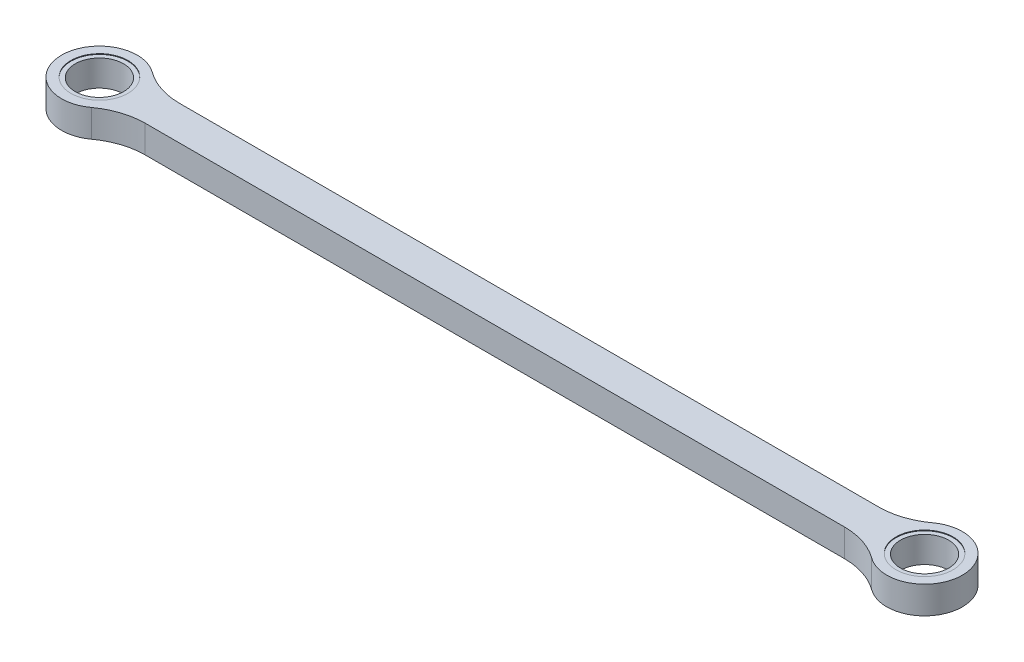
ISO-10303-21;
HEADER;
FILE_DESCRIPTION(('STEP AP214'),'2;1');
FILE_NAME('part.step','',(''),(''),'','','');
FILE_SCHEMA(('AUTOMOTIVE_DESIGN { 1 0 10303 214 1 1 1 1 }'));
ENDSEC;
DATA;
#1=APPLICATION_CONTEXT('core data for automotive mechanical design processes');
#2=APPLICATION_PROTOCOL_DEFINITION('international standard','automotive_design',2000,#1);
#3=PRODUCT_CONTEXT('',#1,'mechanical');
#4=PRODUCT('Part','Part','',(#3));
#5=PRODUCT_RELATED_PRODUCT_CATEGORY('part','',(#4));
#6=PRODUCT_DEFINITION_FORMATION('','',#4);
#7=PRODUCT_DEFINITION_CONTEXT('part definition',#1,'design');
#8=PRODUCT_DEFINITION('design','',#6,#7);
#9=PRODUCT_DEFINITION_SHAPE('','',#8);
#10=(LENGTH_UNIT() NAMED_UNIT(*) SI_UNIT(.MILLI.,.METRE.));
#11=(NAMED_UNIT(*) PLANE_ANGLE_UNIT() SI_UNIT($,.RADIAN.));
#12=(NAMED_UNIT(*) SI_UNIT($,.STERADIAN.) SOLID_ANGLE_UNIT());
#13=UNCERTAINTY_MEASURE_WITH_UNIT(LENGTH_MEASURE(1.E-05),#10,'distance_accuracy_value','');
#14=(GEOMETRIC_REPRESENTATION_CONTEXT(3) GLOBAL_UNCERTAINTY_ASSIGNED_CONTEXT((#13)) GLOBAL_UNIT_ASSIGNED_CONTEXT((#10,
#11,#12)) REPRESENTATION_CONTEXT('',''));
#15=CARTESIAN_POINT('',(0.,0.,0.));
#16=DIRECTION('',(0.,0.,1.));
#17=DIRECTION('',(1.,0.,0.));
#18=AXIS2_PLACEMENT_3D('',#15,#16,#17);
#19=CARTESIAN_POINT('',(0.,4.,0.));
#20=DIRECTION('',(0.,-1.,0.));
#21=DIRECTION('',(0.,0.,-1.));
#22=AXIS2_PLACEMENT_3D('',#19,#20,#21);
#23=CYLINDRICAL_SURFACE('',#22,3.515);
#24=CARTESIAN_POINT('',(0.,3.9,0.));
#25=DIRECTION('',(0.,1.,0.));
#26=DIRECTION('',(0.,0.,1.));
#27=AXIS2_PLACEMENT_3D('',#24,#25,#26);
#28=CIRCLE('',#27,3.515);
#29=CARTESIAN_POINT('',(0.,3.9,3.515));
#30=VERTEX_POINT('',#29);
#31=EDGE_CURVE('E196',#30,#30,#28,.T.);
#32=ORIENTED_EDGE('',*,*,#31,.T.);
#33=EDGE_LOOP('',(#32));
#34=FACE_BOUND('',#33,.T.);
#35=CARTESIAN_POINT('',(0.,0.0999999999999998,0.));
#36=DIRECTION('',(0.,-1.,0.));
#37=DIRECTION('',(0.,0.,-1.));
#38=AXIS2_PLACEMENT_3D('',#35,#36,#37);
#39=CIRCLE('',#38,3.515);
#40=CARTESIAN_POINT('',(0.,0.0999999999999998,-3.515));
#41=VERTEX_POINT('',#40);
#42=EDGE_CURVE('E49',#41,#41,#39,.T.);
#43=ORIENTED_EDGE('',*,*,#42,.T.);
#44=EDGE_LOOP('',(#43));
#45=FACE_BOUND('',#44,.T.);
#46=ADVANCED_FACE('F45',(#34,#45),#23,.F.);
#47=CARTESIAN_POINT('',(120.,4.,0.));
#48=DIRECTION('',(0.,-1.,0.));
#49=DIRECTION('',(0.,0.,-1.));
#50=AXIS2_PLACEMENT_3D('',#47,#48,#49);
#51=CYLINDRICAL_SURFACE('',#50,3.51500000000001);
#52=CARTESIAN_POINT('',(120.,3.9,0.));
#53=DIRECTION('',(0.,1.,0.));
#54=DIRECTION('',(0.,0.,1.));
#55=AXIS2_PLACEMENT_3D('',#52,#53,#54);
#56=CIRCLE('',#55,3.51500000000001);
#57=CARTESIAN_POINT('',(120.,3.9,3.51500000000001));
#58=VERTEX_POINT('',#57);
#59=EDGE_CURVE('E192',#58,#58,#56,.T.);
#60=ORIENTED_EDGE('',*,*,#59,.T.);
#61=EDGE_LOOP('',(#60));
#62=FACE_BOUND('',#61,.T.);
#63=CARTESIAN_POINT('',(120.,0.0999999999999998,0.));
#64=DIRECTION('',(0.,-1.,0.));
#65=DIRECTION('',(0.,0.,-1.));
#66=AXIS2_PLACEMENT_3D('',#63,#64,#65);
#67=CIRCLE('',#66,3.51500000000001);
#68=CARTESIAN_POINT('',(120.,0.0999999999999998,-3.51500000000001));
#69=VERTEX_POINT('',#68);
#70=EDGE_CURVE('E199',#69,#69,#67,.T.);
#71=ORIENTED_EDGE('',*,*,#70,.T.);
#72=EDGE_LOOP('',(#71));
#73=FACE_BOUND('',#72,.T.);
#74=ADVANCED_FACE('F269',(#62,#73),#51,.F.);
#75=CARTESIAN_POINT('',(0.,4.,0.));
#76=DIRECTION('',(0.,1.,0.));
#77=DIRECTION('',(0.,0.,1.));
#78=AXIS2_PLACEMENT_3D('',#75,#76,#77);
#79=PLANE('',#78);
#80=CARTESIAN_POINT('',(0.,4.,0.));
#81=DIRECTION('',(0.,1.,0.));
#82=DIRECTION('',(0.,0.,1.));
#83=AXIS2_PLACEMENT_3D('',#80,#81,#82);
#84=CIRCLE('',#83,4.15);
#85=CARTESIAN_POINT('',(0.,4.,4.15));
#86=VERTEX_POINT('',#85);
#87=EDGE_CURVE('E230',#86,#86,#84,.T.);
#88=ORIENTED_EDGE('',*,*,#87,.F.);
#89=EDGE_LOOP('',(#88));
#90=FACE_BOUND('',#89,.T.);
#91=CARTESIAN_POINT('',(120.,4.,0.));
#92=DIRECTION('',(0.,1.,0.));
#93=DIRECTION('',(0.,0.,1.));
#94=AXIS2_PLACEMENT_3D('',#91,#92,#93);
#95=CIRCLE('',#94,4.15);
#96=CARTESIAN_POINT('',(120.,4.,4.15));
#97=VERTEX_POINT('',#96);
#98=EDGE_CURVE('E233',#97,#97,#95,.T.);
#99=ORIENTED_EDGE('',*,*,#98,.F.);
#100=EDGE_LOOP('',(#99));
#101=FACE_BOUND('',#100,.T.);
#102=DIRECTION('',(-1.,0.,0.));
#103=VECTOR('',#102,1.);
#104=CARTESIAN_POINT('',(4.89897948556636,4.,-2.5));
#105=LINE('',#104,#103);
#106=CARTESIAN_POINT('',(110.834848610088,4.,-2.5));
#107=VERTEX_POINT('',#106);
#108=CARTESIAN_POINT('',(9.16515138991168,4.,-2.5));
#109=VERTEX_POINT('',#108);
#110=EDGE_CURVE('E158',#107,#109,#105,.T.);
#111=ORIENTED_EDGE('',*,*,#110,.T.);
#112=CARTESIAN_POINT('',(9.16515138991168,4.,-12.5));
#113=DIRECTION('',(0.,1.,0.));
#114=DIRECTION('',(0.,0.,1.));
#115=AXIS2_PLACEMENT_3D('',#112,#113,#114);
#116=CIRCLE('',#115,10.);
#117=CARTESIAN_POINT('',(3.25215049319447,4.,-4.43548387096774));
#118=VERTEX_POINT('',#117);
#119=EDGE_CURVE('E11',#109,#118,#116,.F.);
#120=ORIENTED_EDGE('',*,*,#119,.T.);
#121=CARTESIAN_POINT('',(0.,4.,0.));
#122=DIRECTION('',(0.,1.,0.));
#123=DIRECTION('',(0.,0.,1.));
#124=AXIS2_PLACEMENT_3D('',#121,#122,#123);
#125=CIRCLE('',#124,5.5);
#126=CARTESIAN_POINT('',(3.25215049319447,4.,4.43548387096774));
#127=VERTEX_POINT('',#126);
#128=EDGE_CURVE('E150',#118,#127,#125,.T.);
#129=ORIENTED_EDGE('',*,*,#128,.T.);
#130=CARTESIAN_POINT('',(9.16515138991168,4.,12.5));
#131=DIRECTION('',(0.,1.,0.));
#132=DIRECTION('',(0.,0.,1.));
#133=AXIS2_PLACEMENT_3D('',#130,#131,#132);
#134=CIRCLE('',#133,10.);
#135=CARTESIAN_POINT('',(9.16515138991168,4.,2.5));
#136=VERTEX_POINT('',#135);
#137=EDGE_CURVE('E187',#127,#136,#134,.F.);
#138=ORIENTED_EDGE('',*,*,#137,.T.);
#139=DIRECTION('',(1.,0.,0.));
#140=VECTOR('',#139,1.);
#141=CARTESIAN_POINT('',(4.89897948556636,4.,2.5));
#142=LINE('',#141,#140);
#143=CARTESIAN_POINT('',(110.834848610088,4.,2.5));
#144=VERTEX_POINT('',#143);
#145=EDGE_CURVE('E242',#136,#144,#142,.T.);
#146=ORIENTED_EDGE('',*,*,#145,.T.);
#147=CARTESIAN_POINT('',(110.834848610088,4.,12.5));
#148=DIRECTION('',(0.,1.,0.));
#149=DIRECTION('',(0.,0.,1.));
#150=AXIS2_PLACEMENT_3D('',#147,#148,#149);
#151=CIRCLE('',#150,10.);
#152=CARTESIAN_POINT('',(116.747849506806,4.,4.43548387096774));
#153=VERTEX_POINT('',#152);
#154=EDGE_CURVE('E124',#144,#153,#151,.F.);
#155=ORIENTED_EDGE('',*,*,#154,.T.);
#156=CARTESIAN_POINT('',(120.,4.,0.));
#157=DIRECTION('',(0.,1.,0.));
#158=DIRECTION('',(0.,0.,-1.));
#159=AXIS2_PLACEMENT_3D('',#156,#157,#158);
#160=CIRCLE('',#159,5.50000000000001);
#161=CARTESIAN_POINT('',(116.747849506806,4.,-4.43548387096774));
#162=VERTEX_POINT('',#161);
#163=EDGE_CURVE('E133',#153,#162,#160,.T.);
#164=ORIENTED_EDGE('',*,*,#163,.T.);
#165=CARTESIAN_POINT('',(110.834848610088,4.,-12.5));
#166=DIRECTION('',(0.,1.,0.));
#167=DIRECTION('',(0.,0.,1.));
#168=AXIS2_PLACEMENT_3D('',#165,#166,#167);
#169=CIRCLE('',#168,10.);
#170=EDGE_CURVE('E181',#162,#107,#169,.F.);
#171=ORIENTED_EDGE('',*,*,#170,.T.);
#172=EDGE_LOOP('',(#111,#120,#129,#138,#146,#155,#164,#171));
#173=FACE_BOUND('',#172,.T.);
#174=ADVANCED_FACE('F257',(#90,#101,#173),#79,.T.);
#175=CARTESIAN_POINT('',(0.,0.,0.));
#176=DIRECTION('',(0.,1.,0.));
#177=DIRECTION('',(0.,0.,1.));
#178=AXIS2_PLACEMENT_3D('',#175,#176,#177);
#179=PLANE('',#178);
#180=CARTESIAN_POINT('',(0.,0.,0.));
#181=DIRECTION('',(0.,-1.,0.));
#182=DIRECTION('',(0.,0.,-1.));
#183=AXIS2_PLACEMENT_3D('',#180,#181,#182);
#184=CIRCLE('',#183,4.15);
#185=CARTESIAN_POINT('',(0.,0.,-4.15));
#186=VERTEX_POINT('',#185);
#187=EDGE_CURVE('E210',#186,#186,#184,.T.);
#188=ORIENTED_EDGE('',*,*,#187,.F.);
#189=EDGE_LOOP('',(#188));
#190=FACE_BOUND('',#189,.T.);
#191=CARTESIAN_POINT('',(120.,0.,0.));
#192=DIRECTION('',(0.,-1.,0.));
#193=DIRECTION('',(0.,0.,-1.));
#194=AXIS2_PLACEMENT_3D('',#191,#192,#193);
#195=CIRCLE('',#194,4.15);
#196=CARTESIAN_POINT('',(120.,0.,-4.15));
#197=VERTEX_POINT('',#196);
#198=EDGE_CURVE('E217',#197,#197,#195,.T.);
#199=ORIENTED_EDGE('',*,*,#198,.F.);
#200=EDGE_LOOP('',(#199));
#201=FACE_BOUND('',#200,.T.);
#202=CARTESIAN_POINT('',(0.,0.,0.));
#203=DIRECTION('',(0.,1.,0.));
#204=DIRECTION('',(0.,0.,1.));
#205=AXIS2_PLACEMENT_3D('',#202,#203,#204);
#206=CIRCLE('',#205,5.5);
#207=CARTESIAN_POINT('',(3.25215049319447,0.,-4.43548387096774));
#208=VERTEX_POINT('',#207);
#209=CARTESIAN_POINT('',(3.25215049319447,0.,4.43548387096774));
#210=VERTEX_POINT('',#209);
#211=EDGE_CURVE('E153',#208,#210,#206,.T.);
#212=ORIENTED_EDGE('',*,*,#211,.F.);
#213=CARTESIAN_POINT('',(9.16515138991168,0.,-12.5));
#214=DIRECTION('',(0.,1.,0.));
#215=DIRECTION('',(0.,0.,1.));
#216=AXIS2_PLACEMENT_3D('',#213,#214,#215);
#217=CIRCLE('',#216,10.);
#218=CARTESIAN_POINT('',(9.16515138991168,0.,-2.5));
#219=VERTEX_POINT('',#218);
#220=EDGE_CURVE('E55',#208,#219,#217,.T.);
#221=ORIENTED_EDGE('',*,*,#220,.T.);
#222=DIRECTION('',(-1.,0.,0.));
#223=VECTOR('',#222,1.);
#224=CARTESIAN_POINT('',(4.89897948556636,0.,-2.5));
#225=LINE('',#224,#223);
#226=CARTESIAN_POINT('',(110.834848610088,0.,-2.5));
#227=VERTEX_POINT('',#226);
#228=EDGE_CURVE('E143',#227,#219,#225,.T.);
#229=ORIENTED_EDGE('',*,*,#228,.F.);
#230=CARTESIAN_POINT('',(110.834848610088,0.,-12.5));
#231=DIRECTION('',(0.,1.,0.));
#232=DIRECTION('',(0.,0.,1.));
#233=AXIS2_PLACEMENT_3D('',#230,#231,#232);
#234=CIRCLE('',#233,10.);
#235=CARTESIAN_POINT('',(116.747849506806,0.,-4.43548387096774));
#236=VERTEX_POINT('',#235);
#237=EDGE_CURVE('E141',#227,#236,#234,.T.);
#238=ORIENTED_EDGE('',*,*,#237,.T.);
#239=CARTESIAN_POINT('',(120.,0.,0.));
#240=DIRECTION('',(0.,1.,0.));
#241=DIRECTION('',(0.,0.,-1.));
#242=AXIS2_PLACEMENT_3D('',#239,#240,#241);
#243=CIRCLE('',#242,5.50000000000001);
#244=CARTESIAN_POINT('',(116.747849506806,0.,4.43548387096774));
#245=VERTEX_POINT('',#244);
#246=EDGE_CURVE('E130',#245,#236,#243,.T.);
#247=ORIENTED_EDGE('',*,*,#246,.F.);
#248=CARTESIAN_POINT('',(110.834848610088,0.,12.5));
#249=DIRECTION('',(0.,1.,0.));
#250=DIRECTION('',(0.,0.,1.));
#251=AXIS2_PLACEMENT_3D('',#248,#249,#250);
#252=CIRCLE('',#251,10.);
#253=CARTESIAN_POINT('',(110.834848610088,0.,2.5));
#254=VERTEX_POINT('',#253);
#255=EDGE_CURVE('E113',#245,#254,#252,.T.);
#256=ORIENTED_EDGE('',*,*,#255,.T.);
#257=DIRECTION('',(1.,0.,0.));
#258=VECTOR('',#257,1.);
#259=CARTESIAN_POINT('',(4.89897948556636,0.,2.5));
#260=LINE('',#259,#258);
#261=CARTESIAN_POINT('',(9.16515138991168,0.,2.5));
#262=VERTEX_POINT('',#261);
#263=EDGE_CURVE('E144',#262,#254,#260,.T.);
#264=ORIENTED_EDGE('',*,*,#263,.F.);
#265=CARTESIAN_POINT('',(9.16515138991168,0.,12.5));
#266=DIRECTION('',(0.,1.,0.));
#267=DIRECTION('',(0.,0.,1.));
#268=AXIS2_PLACEMENT_3D('',#265,#266,#267);
#269=CIRCLE('',#268,10.);
#270=EDGE_CURVE('E184',#262,#210,#269,.T.);
#271=ORIENTED_EDGE('',*,*,#270,.T.);
#272=EDGE_LOOP('',(#212,#221,#229,#238,#247,#256,#264,#271));
#273=FACE_BOUND('',#272,.T.);
#274=ADVANCED_FACE('F139',(#190,#201,#273),#179,.F.);
#275=CARTESIAN_POINT('',(0.,4.,0.));
#276=DIRECTION('',(0.,-1.,0.));
#277=DIRECTION('',(0.,0.,-1.));
#278=AXIS2_PLACEMENT_3D('',#275,#276,#277);
#279=CYLINDRICAL_SURFACE('',#278,5.5);
#280=ORIENTED_EDGE('',*,*,#211,.T.);
#281=DIRECTION('',(0.,-1.,0.));
#282=VECTOR('',#281,1.);
#283=CARTESIAN_POINT('',(3.25215049319447,4.,4.43548387096774));
#284=LINE('',#283,#282);
#285=EDGE_CURVE('E63',#210,#127,#284,.F.);
#286=ORIENTED_EDGE('',*,*,#285,.T.);
#287=ORIENTED_EDGE('',*,*,#128,.F.);
#288=DIRECTION('',(0.,-1.,0.));
#289=VECTOR('',#288,1.);
#290=CARTESIAN_POINT('',(3.25215049319447,4.,-4.43548387096774));
#291=LINE('',#290,#289);
#292=EDGE_CURVE('E172',#118,#208,#291,.T.);
#293=ORIENTED_EDGE('',*,*,#292,.T.);
#294=EDGE_LOOP('',(#280,#286,#287,#293));
#295=FACE_BOUND('',#294,.T.);
#296=ADVANCED_FACE('F250',(#295),#279,.T.);
#297=CARTESIAN_POINT('',(4.89897948556636,4.,2.5));
#298=DIRECTION('',(0.,0.,-1.));
#299=DIRECTION('',(-1.,0.,0.));
#300=AXIS2_PLACEMENT_3D('',#297,#298,#299);
#301=PLANE('',#300);
#302=ORIENTED_EDGE('',*,*,#263,.T.);
#303=DIRECTION('',(0.,1.,0.));
#304=VECTOR('',#303,1.);
#305=CARTESIAN_POINT('',(110.834848610088,4.,2.5));
#306=LINE('',#305,#304);
#307=EDGE_CURVE('E118',#254,#144,#306,.T.);
#308=ORIENTED_EDGE('',*,*,#307,.T.);
#309=ORIENTED_EDGE('',*,*,#145,.F.);
#310=DIRECTION('',(0.,1.,0.));
#311=VECTOR('',#310,1.);
#312=CARTESIAN_POINT('',(9.16515138991168,0.,2.5));
#313=LINE('',#312,#311);
#314=EDGE_CURVE('E135',#136,#262,#313,.F.);
#315=ORIENTED_EDGE('',*,*,#314,.T.);
#316=EDGE_LOOP('',(#302,#308,#309,#315));
#317=FACE_BOUND('',#316,.T.);
#318=ADVANCED_FACE('F259',(#317),#301,.F.);
#319=CARTESIAN_POINT('',(120.,4.,0.));
#320=DIRECTION('',(0.,-1.,0.));
#321=DIRECTION('',(0.,0.,-1.));
#322=AXIS2_PLACEMENT_3D('',#319,#320,#321);
#323=CYLINDRICAL_SURFACE('',#322,5.50000000000001);
#324=ORIENTED_EDGE('',*,*,#163,.F.);
#325=DIRECTION('',(0.,-1.,0.));
#326=VECTOR('',#325,1.);
#327=CARTESIAN_POINT('',(116.747849506806,4.,4.43548387096774));
#328=LINE('',#327,#326);
#329=EDGE_CURVE('E117',#153,#245,#328,.T.);
#330=ORIENTED_EDGE('',*,*,#329,.T.);
#331=ORIENTED_EDGE('',*,*,#246,.T.);
#332=DIRECTION('',(0.,-1.,0.));
#333=VECTOR('',#332,1.);
#334=CARTESIAN_POINT('',(116.747849506806,4.,-4.43548387096774));
#335=LINE('',#334,#333);
#336=EDGE_CURVE('E136',#236,#162,#335,.F.);
#337=ORIENTED_EDGE('',*,*,#336,.T.);
#338=EDGE_LOOP('',(#324,#330,#331,#337));
#339=FACE_BOUND('',#338,.T.);
#340=ADVANCED_FACE('F129',(#339),#323,.T.);
#341=CARTESIAN_POINT('',(4.89897948556636,4.,-2.5));
#342=DIRECTION('',(0.,0.,1.));
#343=DIRECTION('',(1.,0.,0.));
#344=AXIS2_PLACEMENT_3D('',#341,#342,#343);
#345=PLANE('',#344);
#346=ORIENTED_EDGE('',*,*,#110,.F.);
#347=DIRECTION('',(0.,1.,0.));
#348=VECTOR('',#347,1.);
#349=CARTESIAN_POINT('',(110.834848610088,0.,-2.5));
#350=LINE('',#349,#348);
#351=EDGE_CURVE('E168',#107,#227,#350,.F.);
#352=ORIENTED_EDGE('',*,*,#351,.T.);
#353=ORIENTED_EDGE('',*,*,#228,.T.);
#354=DIRECTION('',(0.,1.,0.));
#355=VECTOR('',#354,1.);
#356=CARTESIAN_POINT('',(9.16515138991168,4.,-2.5));
#357=LINE('',#356,#355);
#358=EDGE_CURVE('E165',#219,#109,#357,.T.);
#359=ORIENTED_EDGE('',*,*,#358,.T.);
#360=EDGE_LOOP('',(#346,#352,#353,#359));
#361=FACE_BOUND('',#360,.T.);
#362=ADVANCED_FACE('F265',(#361),#345,.F.);
#363=CARTESIAN_POINT('',(110.834848610088,4.,12.5));
#364=DIRECTION('',(0.,-1.,0.));
#365=DIRECTION('',(0.,0.,-1.));
#366=AXIS2_PLACEMENT_3D('',#363,#364,#365);
#367=CYLINDRICAL_SURFACE('',#366,10.);
#368=ORIENTED_EDGE('',*,*,#154,.F.);
#369=ORIENTED_EDGE('',*,*,#307,.F.);
#370=ORIENTED_EDGE('',*,*,#255,.F.);
#371=ORIENTED_EDGE('',*,*,#329,.F.);
#372=EDGE_LOOP('',(#368,#369,#370,#371));
#373=FACE_BOUND('',#372,.T.);
#374=ADVANCED_FACE('F116',(#373),#367,.F.);
#375=CARTESIAN_POINT('',(110.834848610088,4.,-12.5));
#376=DIRECTION('',(0.,-1.,0.));
#377=DIRECTION('',(0.,0.,-1.));
#378=AXIS2_PLACEMENT_3D('',#375,#376,#377);
#379=CYLINDRICAL_SURFACE('',#378,10.);
#380=ORIENTED_EDGE('',*,*,#170,.F.);
#381=ORIENTED_EDGE('',*,*,#336,.F.);
#382=ORIENTED_EDGE('',*,*,#237,.F.);
#383=ORIENTED_EDGE('',*,*,#351,.F.);
#384=EDGE_LOOP('',(#380,#381,#382,#383));
#385=FACE_BOUND('',#384,.T.);
#386=ADVANCED_FACE('F289',(#385),#379,.F.);
#387=CARTESIAN_POINT('',(9.16515138991168,4.,12.5));
#388=DIRECTION('',(0.,-1.,0.));
#389=DIRECTION('',(0.,0.,-1.));
#390=AXIS2_PLACEMENT_3D('',#387,#388,#389);
#391=CYLINDRICAL_SURFACE('',#390,10.);
#392=ORIENTED_EDGE('',*,*,#137,.F.);
#393=ORIENTED_EDGE('',*,*,#285,.F.);
#394=ORIENTED_EDGE('',*,*,#270,.F.);
#395=ORIENTED_EDGE('',*,*,#314,.F.);
#396=EDGE_LOOP('',(#392,#393,#394,#395));
#397=FACE_BOUND('',#396,.T.);
#398=ADVANCED_FACE('F254',(#397),#391,.F.);
#399=CARTESIAN_POINT('',(9.16515138991168,4.,-12.5));
#400=DIRECTION('',(0.,-1.,0.));
#401=DIRECTION('',(0.,0.,-1.));
#402=AXIS2_PLACEMENT_3D('',#399,#400,#401);
#403=CYLINDRICAL_SURFACE('',#402,10.);
#404=ORIENTED_EDGE('',*,*,#119,.F.);
#405=ORIENTED_EDGE('',*,*,#358,.F.);
#406=ORIENTED_EDGE('',*,*,#220,.F.);
#407=ORIENTED_EDGE('',*,*,#292,.F.);
#408=EDGE_LOOP('',(#404,#405,#406,#407));
#409=FACE_BOUND('',#408,.T.);
#410=ADVANCED_FACE('F47',(#409),#403,.F.);
#411=CARTESIAN_POINT('',(120.,3.9,0.));
#412=DIRECTION('',(0.,1.,0.));
#413=DIRECTION('',(0.,0.,1.));
#414=AXIS2_PLACEMENT_3D('',#411,#412,#413);
#415=CYLINDRICAL_SURFACE('',#414,4.15);
#416=CARTESIAN_POINT('',(120.,3.9,0.));
#417=DIRECTION('',(0.,1.,0.));
#418=DIRECTION('',(0.,0.,1.));
#419=AXIS2_PLACEMENT_3D('',#416,#417,#418);
#420=CIRCLE('',#419,4.15);
#421=CARTESIAN_POINT('',(120.,3.9,4.15));
#422=VERTEX_POINT('',#421);
#423=EDGE_CURVE('E207',#422,#422,#420,.T.);
#424=ORIENTED_EDGE('',*,*,#423,.F.);
#425=EDGE_LOOP('',(#424));
#426=FACE_BOUND('',#425,.T.);
#427=ORIENTED_EDGE('',*,*,#98,.T.);
#428=EDGE_LOOP('',(#427));
#429=FACE_BOUND('',#428,.T.);
#430=ADVANCED_FACE('F302',(#426,#429),#415,.F.);
#431=CARTESIAN_POINT('',(120.,3.9,0.));
#432=DIRECTION('',(0.,1.,0.));
#433=DIRECTION('',(0.,0.,1.));
#434=AXIS2_PLACEMENT_3D('',#431,#432,#433);
#435=PLANE('',#434);
#436=ORIENTED_EDGE('',*,*,#59,.F.);
#437=EDGE_LOOP('',(#436));
#438=FACE_BOUND('',#437,.T.);
#439=ORIENTED_EDGE('',*,*,#423,.T.);
#440=EDGE_LOOP('',(#439));
#441=FACE_BOUND('',#440,.T.);
#442=ADVANCED_FACE('F306',(#438,#441),#435,.T.);
#443=CARTESIAN_POINT('',(0.,3.9,0.));
#444=DIRECTION('',(0.,1.,0.));
#445=DIRECTION('',(0.,0.,1.));
#446=AXIS2_PLACEMENT_3D('',#443,#444,#445);
#447=CYLINDRICAL_SURFACE('',#446,4.15);
#448=CARTESIAN_POINT('',(0.,3.9,0.));
#449=DIRECTION('',(0.,1.,0.));
#450=DIRECTION('',(0.,0.,1.));
#451=AXIS2_PLACEMENT_3D('',#448,#449,#450);
#452=CIRCLE('',#451,4.15);
#453=CARTESIAN_POINT('',(0.,3.9,4.15));
#454=VERTEX_POINT('',#453);
#455=EDGE_CURVE('E197',#454,#454,#452,.T.);
#456=ORIENTED_EDGE('',*,*,#455,.F.);
#457=EDGE_LOOP('',(#456));
#458=FACE_BOUND('',#457,.T.);
#459=ORIENTED_EDGE('',*,*,#87,.T.);
#460=EDGE_LOOP('',(#459));
#461=FACE_BOUND('',#460,.T.);
#462=ADVANCED_FACE('F311',(#458,#461),#447,.F.);
#463=CARTESIAN_POINT('',(0.,3.9,0.));
#464=DIRECTION('',(0.,1.,0.));
#465=DIRECTION('',(0.,0.,1.));
#466=AXIS2_PLACEMENT_3D('',#463,#464,#465);
#467=PLANE('',#466);
#468=ORIENTED_EDGE('',*,*,#31,.F.);
#469=EDGE_LOOP('',(#468));
#470=FACE_BOUND('',#469,.T.);
#471=ORIENTED_EDGE('',*,*,#455,.T.);
#472=EDGE_LOOP('',(#471));
#473=FACE_BOUND('',#472,.T.);
#474=ADVANCED_FACE('F318',(#470,#473),#467,.T.);
#475=CARTESIAN_POINT('',(120.,0.1,0.));
#476=DIRECTION('',(0.,-1.,0.));
#477=DIRECTION('',(0.,0.,-1.));
#478=AXIS2_PLACEMENT_3D('',#475,#476,#477);
#479=CYLINDRICAL_SURFACE('',#478,4.15);
#480=CARTESIAN_POINT('',(120.,0.1,0.));
#481=DIRECTION('',(0.,-1.,0.));
#482=DIRECTION('',(0.,0.,-1.));
#483=AXIS2_PLACEMENT_3D('',#480,#481,#482);
#484=CIRCLE('',#483,4.15);
#485=CARTESIAN_POINT('',(120.,0.1,-4.15));
#486=VERTEX_POINT('',#485);
#487=EDGE_CURVE('E223',#486,#486,#484,.T.);
#488=ORIENTED_EDGE('',*,*,#487,.F.);
#489=EDGE_LOOP('',(#488));
#490=FACE_BOUND('',#489,.T.);
#491=ORIENTED_EDGE('',*,*,#198,.T.);
#492=EDGE_LOOP('',(#491));
#493=FACE_BOUND('',#492,.T.);
#494=ADVANCED_FACE('F322',(#490,#493),#479,.F.);
#495=CARTESIAN_POINT('',(120.,0.1,0.));
#496=DIRECTION('',(0.,-1.,0.));
#497=DIRECTION('',(0.,0.,-1.));
#498=AXIS2_PLACEMENT_3D('',#495,#496,#497);
#499=PLANE('',#498);
#500=ORIENTED_EDGE('',*,*,#70,.F.);
#501=EDGE_LOOP('',(#500));
#502=FACE_BOUND('',#501,.T.);
#503=ORIENTED_EDGE('',*,*,#487,.T.);
#504=EDGE_LOOP('',(#503));
#505=FACE_BOUND('',#504,.T.);
#506=ADVANCED_FACE('F324',(#502,#505),#499,.T.);
#507=CARTESIAN_POINT('',(0.,0.1,0.));
#508=DIRECTION('',(0.,-1.,0.));
#509=DIRECTION('',(0.,0.,-1.));
#510=AXIS2_PLACEMENT_3D('',#507,#508,#509);
#511=CYLINDRICAL_SURFACE('',#510,4.15);
#512=CARTESIAN_POINT('',(0.,0.1,0.));
#513=DIRECTION('',(0.,-1.,0.));
#514=DIRECTION('',(0.,0.,-1.));
#515=AXIS2_PLACEMENT_3D('',#512,#513,#514);
#516=CIRCLE('',#515,4.15);
#517=CARTESIAN_POINT('',(0.,0.1,-4.15));
#518=VERTEX_POINT('',#517);
#519=EDGE_CURVE('E202',#518,#518,#516,.T.);
#520=ORIENTED_EDGE('',*,*,#519,.F.);
#521=EDGE_LOOP('',(#520));
#522=FACE_BOUND('',#521,.T.);
#523=ORIENTED_EDGE('',*,*,#187,.T.);
#524=EDGE_LOOP('',(#523));
#525=FACE_BOUND('',#524,.T.);
#526=ADVANCED_FACE('F327',(#522,#525),#511,.F.);
#527=CARTESIAN_POINT('',(0.,0.1,0.));
#528=DIRECTION('',(0.,-1.,0.));
#529=DIRECTION('',(0.,0.,-1.));
#530=AXIS2_PLACEMENT_3D('',#527,#528,#529);
#531=PLANE('',#530);
#532=ORIENTED_EDGE('',*,*,#42,.F.);
#533=EDGE_LOOP('',(#532));
#534=FACE_BOUND('',#533,.T.);
#535=ORIENTED_EDGE('',*,*,#519,.T.);
#536=EDGE_LOOP('',(#535));
#537=FACE_BOUND('',#536,.T.);
#538=ADVANCED_FACE('F334',(#534,#537),#531,.T.);
#539=CLOSED_SHELL('',(#46,#74,#174,#274,#296,#318,#340,#362,#374,#386,#398,#410,#430,#442,#462,
#474,#494,#506,#526,#538));
#540=MANIFOLD_SOLID_BREP('B2',#539);
#541=ADVANCED_BREP_SHAPE_REPRESENTATION('',(#18,#540),#14);
#542=SHAPE_DEFINITION_REPRESENTATION(#9,#541);
ENDSEC;
END-ISO-10303-21;
